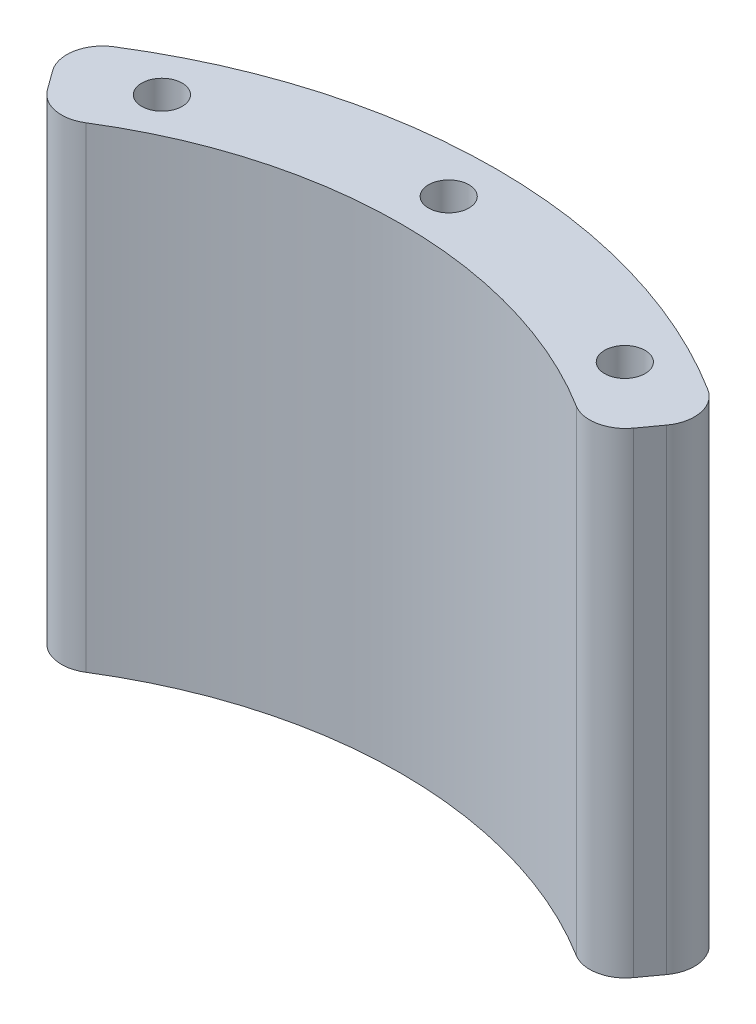
ISO-10303-21;
HEADER;
FILE_DESCRIPTION(('STEP AP214'),'2;1');
FILE_NAME('part.step','',(''),(''),'','','');
FILE_SCHEMA(('AUTOMOTIVE_DESIGN { 1 0 10303 214 1 1 1 1 }'));
ENDSEC;
DATA;
#1=APPLICATION_CONTEXT('core data for automotive mechanical design processes');
#2=APPLICATION_PROTOCOL_DEFINITION('international standard','automotive_design',2000,#1);
#3=PRODUCT_CONTEXT('',#1,'mechanical');
#4=PRODUCT('Part','Part','',(#3));
#5=PRODUCT_RELATED_PRODUCT_CATEGORY('part','',(#4));
#6=PRODUCT_DEFINITION_FORMATION('','',#4);
#7=PRODUCT_DEFINITION_CONTEXT('part definition',#1,'design');
#8=PRODUCT_DEFINITION('design','',#6,#7);
#9=PRODUCT_DEFINITION_SHAPE('','',#8);
#10=(LENGTH_UNIT() NAMED_UNIT(*) SI_UNIT(.MILLI.,.METRE.));
#11=(NAMED_UNIT(*) PLANE_ANGLE_UNIT() SI_UNIT($,.RADIAN.));
#12=(NAMED_UNIT(*) SI_UNIT($,.STERADIAN.) SOLID_ANGLE_UNIT());
#13=UNCERTAINTY_MEASURE_WITH_UNIT(LENGTH_MEASURE(1.E-05),#10,'distance_accuracy_value','');
#14=(GEOMETRIC_REPRESENTATION_CONTEXT(3) GLOBAL_UNCERTAINTY_ASSIGNED_CONTEXT((#13)) GLOBAL_UNIT_ASSIGNED_CONTEXT((#10,
#11,#12)) REPRESENTATION_CONTEXT('',''));
#15=CARTESIAN_POINT('',(0.,0.,0.));
#16=DIRECTION('',(0.,0.,1.));
#17=DIRECTION('',(1.,0.,0.));
#18=AXIS2_PLACEMENT_3D('',#15,#16,#17);
#19=CARTESIAN_POINT('',(0.,40.,0.));
#20=DIRECTION('',(0.,1.,0.));
#21=DIRECTION('',(0.,0.,1.));
#22=AXIS2_PLACEMENT_3D('',#19,#20,#21);
#23=PLANE('',#22);
#24=CARTESIAN_POINT('',(19.4516499221642,40.,-38.3488372093023));
#25=DIRECTION('',(0.,1.,0.));
#26=DIRECTION('',(0.,0.,1.));
#27=AXIS2_PLACEMENT_3D('',#24,#25,#26);
#28=CIRCLE('',#27,1.7);
#29=CARTESIAN_POINT('',(19.4516499221642,40.,-36.6488372093023));
#30=VERTEX_POINT('',#29);
#31=EDGE_CURVE('E193',#30,#30,#28,.T.);
#32=ORIENTED_EDGE('',*,*,#31,.F.);
#33=EDGE_LOOP('',(#32));
#34=FACE_BOUND('',#33,.T.);
#35=DIRECTION('',(0.587785252292469,0.,0.809016994374951));
#36=VECTOR('',#35,1.);
#37=CARTESIAN_POINT('',(-22.9236248394063,40.,-31.5516627806231));
#38=LINE('',#37,#36);
#39=CARTESIAN_POINT('',(-25.8023666728408,40.,-35.5139109938665));
#40=VERTEX_POINT('',#39);
#41=CARTESIAN_POINT('',(-24.6239230715979,40.,-33.8919225268209));
#42=VERTEX_POINT('',#41);
#43=EDGE_CURVE('E148',#40,#42,#38,.T.);
#44=ORIENTED_EDGE('',*,*,#43,.T.);
#45=CARTESIAN_POINT('',(-22.1968720884731,40.,-35.6552782836983));
#46=DIRECTION('',(0.,1.,0.));
#47=DIRECTION('',(0.,0.,1.));
#48=AXIS2_PLACEMENT_3D('',#45,#46,#47);
#49=CIRCLE('',#48,3.);
#50=CARTESIAN_POINT('',(-20.6113812250107,40.,-33.1084726920055));
#51=VERTEX_POINT('',#50);
#52=EDGE_CURVE('E163',#42,#51,#49,.T.);
#53=ORIENTED_EDGE('',*,*,#52,.T.);
#54=CARTESIAN_POINT('',(0.,40.,0.));
#55=DIRECTION('',(0.,-1.,0.));
#56=DIRECTION('',(0.,0.,1.));
#57=AXIS2_PLACEMENT_3D('',#54,#55,#56);
#58=CIRCLE('',#57,39.);
#59=CARTESIAN_POINT('',(20.6113812250107,40.,-33.1084726920055));
#60=VERTEX_POINT('',#59);
#61=EDGE_CURVE('E126',#51,#60,#58,.T.);
#62=ORIENTED_EDGE('',*,*,#61,.T.);
#63=CARTESIAN_POINT('',(22.1968720884731,40.,-35.6552782836983));
#64=DIRECTION('',(0.,1.,0.));
#65=DIRECTION('',(0.,0.,1.));
#66=AXIS2_PLACEMENT_3D('',#63,#64,#65);
#67=CIRCLE('',#66,3.);
#68=CARTESIAN_POINT('',(24.6239230715979,40.,-33.8919225268209));
#69=VERTEX_POINT('',#68);
#70=EDGE_CURVE('E159',#60,#69,#67,.T.);
#71=ORIENTED_EDGE('',*,*,#70,.T.);
#72=DIRECTION('',(0.587785252292469,0.,-0.809016994374951));
#73=VECTOR('',#72,1.);
#74=CARTESIAN_POINT('',(22.9236248394063,40.,-31.5516627806231));
#75=LINE('',#74,#73);
#76=CARTESIAN_POINT('',(25.8023666728408,40.,-35.5139109938665));
#77=VERTEX_POINT('',#76);
#78=EDGE_CURVE('E175',#69,#77,#75,.T.);
#79=ORIENTED_EDGE('',*,*,#78,.T.);
#80=CARTESIAN_POINT('',(23.375315689716,40.,-37.2772667507439));
#81=DIRECTION('',(0.,1.,0.));
#82=DIRECTION('',(0.,0.,1.));
#83=AXIS2_PLACEMENT_3D('',#80,#81,#82);
#84=CIRCLE('',#83,3.);
#85=CARTESIAN_POINT('',(24.9690872140148,40.,-39.8188985746583));
#86=VERTEX_POINT('',#85);
#87=EDGE_CURVE('E65',#77,#86,#84,.T.);
#88=ORIENTED_EDGE('',*,*,#87,.T.);
#89=CARTESIAN_POINT('',(0.,40.,0.));
#90=DIRECTION('',(0.,1.,0.));
#91=DIRECTION('',(0.,0.,1.));
#92=AXIS2_PLACEMENT_3D('',#89,#90,#91);
#93=CIRCLE('',#92,47.);
#94=CARTESIAN_POINT('',(-24.9690872140148,40.,-39.8188985746583));
#95=VERTEX_POINT('',#94);
#96=EDGE_CURVE('E178',#86,#95,#93,.T.);
#97=ORIENTED_EDGE('',*,*,#96,.T.);
#98=CARTESIAN_POINT('',(-23.375315689716,40.,-37.2772667507439));
#99=DIRECTION('',(0.,1.,0.));
#100=DIRECTION('',(0.,0.,1.));
#101=AXIS2_PLACEMENT_3D('',#98,#99,#100);
#102=CIRCLE('',#101,3.);
#103=EDGE_CURVE('E165',#95,#40,#102,.T.);
#104=ORIENTED_EDGE('',*,*,#103,.T.);
#105=EDGE_LOOP('',(#44,#53,#62,#71,#79,#88,#97,#104));
#106=FACE_BOUND('',#105,.T.);
#107=CARTESIAN_POINT('',(0.,40.,-43.));
#108=DIRECTION('',(0.,1.,0.));
#109=DIRECTION('',(0.,0.,1.));
#110=AXIS2_PLACEMENT_3D('',#107,#108,#109);
#111=CIRCLE('',#110,1.7);
#112=CARTESIAN_POINT('',(0.,40.,-41.3));
#113=VERTEX_POINT('',#112);
#114=EDGE_CURVE('E140',#113,#113,#111,.T.);
#115=ORIENTED_EDGE('',*,*,#114,.F.);
#116=EDGE_LOOP('',(#115));
#117=FACE_BOUND('',#116,.T.);
#118=CARTESIAN_POINT('',(-19.4516499221642,40.,-38.3488372093023));
#119=DIRECTION('',(0.,1.,0.));
#120=DIRECTION('',(0.,0.,1.));
#121=AXIS2_PLACEMENT_3D('',#118,#119,#120);
#122=CIRCLE('',#121,1.7);
#123=CARTESIAN_POINT('',(-19.4516499221642,40.,-36.6488372093023));
#124=VERTEX_POINT('',#123);
#125=EDGE_CURVE('E200',#124,#124,#122,.T.);
#126=ORIENTED_EDGE('',*,*,#125,.F.);
#127=EDGE_LOOP('',(#126));
#128=FACE_BOUND('',#127,.T.);
#129=ADVANCED_FACE('F41',(#34,#106,#117,#128),#23,.T.);
#130=CARTESIAN_POINT('',(0.,0.,0.));
#131=DIRECTION('',(0.,1.,0.));
#132=DIRECTION('',(0.,0.,1.));
#133=AXIS2_PLACEMENT_3D('',#130,#131,#132);
#134=PLANE('',#133);
#135=CARTESIAN_POINT('',(0.,0.,0.));
#136=DIRECTION('',(0.,-1.,0.));
#137=DIRECTION('',(0.,0.,1.));
#138=AXIS2_PLACEMENT_3D('',#135,#136,#137);
#139=CIRCLE('',#138,39.);
#140=CARTESIAN_POINT('',(-20.6113812250107,0.,-33.1084726920055));
#141=VERTEX_POINT('',#140);
#142=CARTESIAN_POINT('',(20.6113812250107,0.,-33.1084726920055));
#143=VERTEX_POINT('',#142);
#144=EDGE_CURVE('E124',#141,#143,#139,.T.);
#145=ORIENTED_EDGE('',*,*,#144,.F.);
#146=CARTESIAN_POINT('',(-22.1968720884731,0.,-35.6552782836983));
#147=DIRECTION('',(0.,1.,0.));
#148=DIRECTION('',(0.,0.,1.));
#149=AXIS2_PLACEMENT_3D('',#146,#147,#148);
#150=CIRCLE('',#149,3.);
#151=CARTESIAN_POINT('',(-24.6239230715979,0.,-33.8919225268209));
#152=VERTEX_POINT('',#151);
#153=EDGE_CURVE('E107',#141,#152,#150,.F.);
#154=ORIENTED_EDGE('',*,*,#153,.T.);
#155=DIRECTION('',(0.587785252292469,0.,0.809016994374951));
#156=VECTOR('',#155,1.);
#157=CARTESIAN_POINT('',(-22.9236248394063,0.,-31.5516627806231));
#158=LINE('',#157,#156);
#159=CARTESIAN_POINT('',(-25.8023666728408,0.,-35.5139109938665));
#160=VERTEX_POINT('',#159);
#161=EDGE_CURVE('E147',#160,#152,#158,.T.);
#162=ORIENTED_EDGE('',*,*,#161,.F.);
#163=CARTESIAN_POINT('',(-23.375315689716,0.,-37.2772667507439));
#164=DIRECTION('',(0.,1.,0.));
#165=DIRECTION('',(0.,0.,1.));
#166=AXIS2_PLACEMENT_3D('',#163,#164,#165);
#167=CIRCLE('',#166,3.);
#168=CARTESIAN_POINT('',(-24.9690872140148,0.,-39.8188985746583));
#169=VERTEX_POINT('',#168);
#170=EDGE_CURVE('E116',#160,#169,#167,.F.);
#171=ORIENTED_EDGE('',*,*,#170,.T.);
#172=CARTESIAN_POINT('',(0.,0.,0.));
#173=DIRECTION('',(0.,1.,0.));
#174=DIRECTION('',(0.,0.,1.));
#175=AXIS2_PLACEMENT_3D('',#172,#173,#174);
#176=CIRCLE('',#175,47.);
#177=CARTESIAN_POINT('',(24.9690872140148,0.,-39.8188985746583));
#178=VERTEX_POINT('',#177);
#179=EDGE_CURVE('E139',#178,#169,#176,.T.);
#180=ORIENTED_EDGE('',*,*,#179,.F.);
#181=CARTESIAN_POINT('',(23.375315689716,0.,-37.2772667507439));
#182=DIRECTION('',(0.,1.,0.));
#183=DIRECTION('',(0.,0.,1.));
#184=AXIS2_PLACEMENT_3D('',#181,#182,#183);
#185=CIRCLE('',#184,3.);
#186=CARTESIAN_POINT('',(25.8023666728408,0.,-35.5139109938665));
#187=VERTEX_POINT('',#186);
#188=EDGE_CURVE('E129',#178,#187,#185,.F.);
#189=ORIENTED_EDGE('',*,*,#188,.T.);
#190=DIRECTION('',(0.587785252292469,0.,-0.809016994374951));
#191=VECTOR('',#190,1.);
#192=CARTESIAN_POINT('',(22.9236248394063,0.,-31.5516627806231));
#193=LINE('',#192,#191);
#194=CARTESIAN_POINT('',(24.6239230715979,0.,-33.8919225268209));
#195=VERTEX_POINT('',#194);
#196=EDGE_CURVE('E136',#195,#187,#193,.T.);
#197=ORIENTED_EDGE('',*,*,#196,.F.);
#198=CARTESIAN_POINT('',(22.1968720884731,0.,-35.6552782836983));
#199=DIRECTION('',(0.,1.,0.));
#200=DIRECTION('',(0.,0.,1.));
#201=AXIS2_PLACEMENT_3D('',#198,#199,#200);
#202=CIRCLE('',#201,3.);
#203=EDGE_CURVE('E133',#195,#143,#202,.F.);
#204=ORIENTED_EDGE('',*,*,#203,.T.);
#205=EDGE_LOOP('',(#145,#154,#162,#171,#180,#189,#197,#204));
#206=FACE_BOUND('',#205,.T.);
#207=CARTESIAN_POINT('',(0.,0.,-43.));
#208=DIRECTION('',(0.,1.,0.));
#209=DIRECTION('',(0.,0.,1.));
#210=AXIS2_PLACEMENT_3D('',#207,#208,#209);
#211=CIRCLE('',#210,1.7);
#212=CARTESIAN_POINT('',(0.,0.,-41.3));
#213=VERTEX_POINT('',#212);
#214=EDGE_CURVE('E141',#213,#213,#211,.T.);
#215=ORIENTED_EDGE('',*,*,#214,.T.);
#216=EDGE_LOOP('',(#215));
#217=FACE_BOUND('',#216,.T.);
#218=CARTESIAN_POINT('',(19.4516499221642,0.,-38.3488372093023));
#219=DIRECTION('',(0.,1.,0.));
#220=DIRECTION('',(0.,0.,1.));
#221=AXIS2_PLACEMENT_3D('',#218,#219,#220);
#222=CIRCLE('',#221,1.7);
#223=CARTESIAN_POINT('',(19.4516499221642,0.,-36.6488372093023));
#224=VERTEX_POINT('',#223);
#225=EDGE_CURVE('E198',#224,#224,#222,.T.);
#226=ORIENTED_EDGE('',*,*,#225,.T.);
#227=EDGE_LOOP('',(#226));
#228=FACE_BOUND('',#227,.T.);
#229=CARTESIAN_POINT('',(-19.4516499221642,0.,-38.3488372093023));
#230=DIRECTION('',(0.,1.,0.));
#231=DIRECTION('',(0.,0.,1.));
#232=AXIS2_PLACEMENT_3D('',#229,#230,#231);
#233=CIRCLE('',#232,1.7);
#234=CARTESIAN_POINT('',(-19.4516499221642,0.,-36.6488372093023));
#235=VERTEX_POINT('',#234);
#236=EDGE_CURVE('E205',#235,#235,#233,.T.);
#237=ORIENTED_EDGE('',*,*,#236,.T.);
#238=EDGE_LOOP('',(#237));
#239=FACE_BOUND('',#238,.T.);
#240=ADVANCED_FACE('F134',(#206,#217,#228,#239),#134,.F.);
#241=CARTESIAN_POINT('',(0.,40.,0.));
#242=DIRECTION('',(0.,-1.,0.));
#243=DIRECTION('',(0.,0.,-1.));
#244=AXIS2_PLACEMENT_3D('',#241,#242,#243);
#245=CYLINDRICAL_SURFACE('',#244,39.);
#246=ORIENTED_EDGE('',*,*,#61,.F.);
#247=DIRECTION('',(0.,-1.,0.));
#248=VECTOR('',#247,1.);
#249=CARTESIAN_POINT('',(-20.6113812250107,40.,-33.1084726920055));
#250=LINE('',#249,#248);
#251=EDGE_CURVE('E115',#51,#141,#250,.T.);
#252=ORIENTED_EDGE('',*,*,#251,.T.);
#253=ORIENTED_EDGE('',*,*,#144,.T.);
#254=DIRECTION('',(0.,-1.,0.));
#255=VECTOR('',#254,1.);
#256=CARTESIAN_POINT('',(20.6113812250107,40.,-33.1084726920055));
#257=LINE('',#256,#255);
#258=EDGE_CURVE('E128',#143,#60,#257,.F.);
#259=ORIENTED_EDGE('',*,*,#258,.T.);
#260=EDGE_LOOP('',(#246,#252,#253,#259));
#261=FACE_BOUND('',#260,.T.);
#262=ADVANCED_FACE('F123',(#261),#245,.F.);
#263=CARTESIAN_POINT('',(22.9236248394063,40.,-31.5516627806231));
#264=DIRECTION('',(-0.809016994374951,0.,-0.587785252292469));
#265=DIRECTION('',(-0.587785252292469,0.,0.809016994374951));
#266=AXIS2_PLACEMENT_3D('',#263,#264,#265);
#267=PLANE('',#266);
#268=ORIENTED_EDGE('',*,*,#78,.F.);
#269=DIRECTION('',(0.,-1.,0.));
#270=VECTOR('',#269,1.);
#271=CARTESIAN_POINT('',(24.6239230715979,40.,-33.8919225268209));
#272=LINE('',#271,#270);
#273=EDGE_CURVE('E11',#69,#195,#272,.T.);
#274=ORIENTED_EDGE('',*,*,#273,.T.);
#275=ORIENTED_EDGE('',*,*,#196,.T.);
#276=DIRECTION('',(0.,-1.,0.));
#277=VECTOR('',#276,1.);
#278=CARTESIAN_POINT('',(25.8023666728408,40.,-35.5139109938665));
#279=LINE('',#278,#277);
#280=EDGE_CURVE('E47',#187,#77,#279,.F.);
#281=ORIENTED_EDGE('',*,*,#280,.T.);
#282=EDGE_LOOP('',(#268,#274,#275,#281));
#283=FACE_BOUND('',#282,.T.);
#284=ADVANCED_FACE('F174',(#283),#267,.F.);
#285=CARTESIAN_POINT('',(0.,40.,0.));
#286=DIRECTION('',(0.,-1.,0.));
#287=DIRECTION('',(0.,0.,-1.));
#288=AXIS2_PLACEMENT_3D('',#285,#286,#287);
#289=CYLINDRICAL_SURFACE('',#288,47.);
#290=ORIENTED_EDGE('',*,*,#179,.T.);
#291=DIRECTION('',(0.,-1.,0.));
#292=VECTOR('',#291,1.);
#293=CARTESIAN_POINT('',(-24.9690872140148,40.,-39.8188985746583));
#294=LINE('',#293,#292);
#295=EDGE_CURVE('E57',#169,#95,#294,.F.);
#296=ORIENTED_EDGE('',*,*,#295,.T.);
#297=ORIENTED_EDGE('',*,*,#96,.F.);
#298=DIRECTION('',(0.,-1.,0.));
#299=VECTOR('',#298,1.);
#300=CARTESIAN_POINT('',(24.9690872140148,40.,-39.8188985746583));
#301=LINE('',#300,#299);
#302=EDGE_CURVE('E167',#86,#178,#301,.T.);
#303=ORIENTED_EDGE('',*,*,#302,.T.);
#304=EDGE_LOOP('',(#290,#296,#297,#303));
#305=FACE_BOUND('',#304,.T.);
#306=ADVANCED_FACE('F181',(#305),#289,.T.);
#307=CARTESIAN_POINT('',(-22.9236248394063,40.,-31.5516627806231));
#308=DIRECTION('',(0.809016994374951,0.,-0.587785252292469));
#309=DIRECTION('',(-0.587785252292469,0.,-0.809016994374951));
#310=AXIS2_PLACEMENT_3D('',#307,#308,#309);
#311=PLANE('',#310);
#312=ORIENTED_EDGE('',*,*,#161,.T.);
#313=DIRECTION('',(0.,-1.,0.));
#314=VECTOR('',#313,1.);
#315=CARTESIAN_POINT('',(-24.6239230715979,40.,-33.8919225268209));
#316=LINE('',#315,#314);
#317=EDGE_CURVE('E114',#152,#42,#316,.F.);
#318=ORIENTED_EDGE('',*,*,#317,.T.);
#319=ORIENTED_EDGE('',*,*,#43,.F.);
#320=DIRECTION('',(0.,-1.,0.));
#321=VECTOR('',#320,1.);
#322=CARTESIAN_POINT('',(-25.8023666728408,40.,-35.5139109938665));
#323=LINE('',#322,#321);
#324=EDGE_CURVE('E120',#40,#160,#323,.T.);
#325=ORIENTED_EDGE('',*,*,#324,.T.);
#326=EDGE_LOOP('',(#312,#318,#319,#325));
#327=FACE_BOUND('',#326,.T.);
#328=ADVANCED_FACE('F188',(#327),#311,.F.);
#329=CARTESIAN_POINT('',(0.,40.,-43.));
#330=DIRECTION('',(0.,-1.,0.));
#331=DIRECTION('',(0.,0.,-1.));
#332=AXIS2_PLACEMENT_3D('',#329,#330,#331);
#333=CYLINDRICAL_SURFACE('',#332,1.7);
#334=ORIENTED_EDGE('',*,*,#114,.T.);
#335=EDGE_LOOP('',(#334));
#336=FACE_BOUND('',#335,.T.);
#337=ORIENTED_EDGE('',*,*,#214,.F.);
#338=EDGE_LOOP('',(#337));
#339=FACE_BOUND('',#338,.T.);
#340=ADVANCED_FACE('F222',(#336,#339),#333,.F.);
#341=CARTESIAN_POINT('',(19.4516499221642,40.,-38.3488372093023));
#342=DIRECTION('',(0.,-1.,0.));
#343=DIRECTION('',(0.,0.,-1.));
#344=AXIS2_PLACEMENT_3D('',#341,#342,#343);
#345=CYLINDRICAL_SURFACE('',#344,1.7);
#346=ORIENTED_EDGE('',*,*,#31,.T.);
#347=EDGE_LOOP('',(#346));
#348=FACE_BOUND('',#347,.T.);
#349=ORIENTED_EDGE('',*,*,#225,.F.);
#350=EDGE_LOOP('',(#349));
#351=FACE_BOUND('',#350,.T.);
#352=ADVANCED_FACE('F268',(#348,#351),#345,.F.);
#353=CARTESIAN_POINT('',(-19.4516499221642,40.,-38.3488372093023));
#354=DIRECTION('',(0.,-1.,0.));
#355=DIRECTION('',(0.,0.,-1.));
#356=AXIS2_PLACEMENT_3D('',#353,#354,#355);
#357=CYLINDRICAL_SURFACE('',#356,1.7);
#358=ORIENTED_EDGE('',*,*,#125,.T.);
#359=EDGE_LOOP('',(#358));
#360=FACE_BOUND('',#359,.T.);
#361=ORIENTED_EDGE('',*,*,#236,.F.);
#362=EDGE_LOOP('',(#361));
#363=FACE_BOUND('',#362,.T.);
#364=ADVANCED_FACE('F208',(#360,#363),#357,.F.);
#365=CARTESIAN_POINT('',(-22.1968720884731,40.,-35.6552782836983));
#366=DIRECTION('',(0.,-1.,0.));
#367=DIRECTION('',(0.,0.,-1.));
#368=AXIS2_PLACEMENT_3D('',#365,#366,#367);
#369=CYLINDRICAL_SURFACE('',#368,3.);
#370=ORIENTED_EDGE('',*,*,#52,.F.);
#371=ORIENTED_EDGE('',*,*,#317,.F.);
#372=ORIENTED_EDGE('',*,*,#153,.F.);
#373=ORIENTED_EDGE('',*,*,#251,.F.);
#374=EDGE_LOOP('',(#370,#371,#372,#373));
#375=FACE_BOUND('',#374,.T.);
#376=ADVANCED_FACE('F112',(#375),#369,.T.);
#377=CARTESIAN_POINT('',(-23.375315689716,40.,-37.2772667507439));
#378=DIRECTION('',(0.,-1.,0.));
#379=DIRECTION('',(0.,0.,-1.));
#380=AXIS2_PLACEMENT_3D('',#377,#378,#379);
#381=CYLINDRICAL_SURFACE('',#380,3.);
#382=ORIENTED_EDGE('',*,*,#103,.F.);
#383=ORIENTED_EDGE('',*,*,#295,.F.);
#384=ORIENTED_EDGE('',*,*,#170,.F.);
#385=ORIENTED_EDGE('',*,*,#324,.F.);
#386=EDGE_LOOP('',(#382,#383,#384,#385));
#387=FACE_BOUND('',#386,.T.);
#388=ADVANCED_FACE('F189',(#387),#381,.T.);
#389=CARTESIAN_POINT('',(22.1968720884731,40.,-35.6552782836983));
#390=DIRECTION('',(0.,-1.,0.));
#391=DIRECTION('',(0.,0.,-1.));
#392=AXIS2_PLACEMENT_3D('',#389,#390,#391);
#393=CYLINDRICAL_SURFACE('',#392,3.);
#394=ORIENTED_EDGE('',*,*,#70,.F.);
#395=ORIENTED_EDGE('',*,*,#258,.F.);
#396=ORIENTED_EDGE('',*,*,#203,.F.);
#397=ORIENTED_EDGE('',*,*,#273,.F.);
#398=EDGE_LOOP('',(#394,#395,#396,#397));
#399=FACE_BOUND('',#398,.T.);
#400=ADVANCED_FACE('F234',(#399),#393,.T.);
#401=CARTESIAN_POINT('',(23.375315689716,40.,-37.2772667507439));
#402=DIRECTION('',(0.,-1.,0.));
#403=DIRECTION('',(0.,0.,-1.));
#404=AXIS2_PLACEMENT_3D('',#401,#402,#403);
#405=CYLINDRICAL_SURFACE('',#404,3.);
#406=ORIENTED_EDGE('',*,*,#87,.F.);
#407=ORIENTED_EDGE('',*,*,#280,.F.);
#408=ORIENTED_EDGE('',*,*,#188,.F.);
#409=ORIENTED_EDGE('',*,*,#302,.F.);
#410=EDGE_LOOP('',(#406,#407,#408,#409));
#411=FACE_BOUND('',#410,.T.);
#412=ADVANCED_FACE('F43',(#411),#405,.T.);
#413=CLOSED_SHELL('',(#129,#240,#262,#284,#306,#328,#340,#352,#364,#376,#388,#400,#412));
#414=MANIFOLD_SOLID_BREP('B2',#413);
#415=ADVANCED_BREP_SHAPE_REPRESENTATION('',(#18,#414),#14);
#416=SHAPE_DEFINITION_REPRESENTATION(#9,#415);
ENDSEC;
END-ISO-10303-21;
